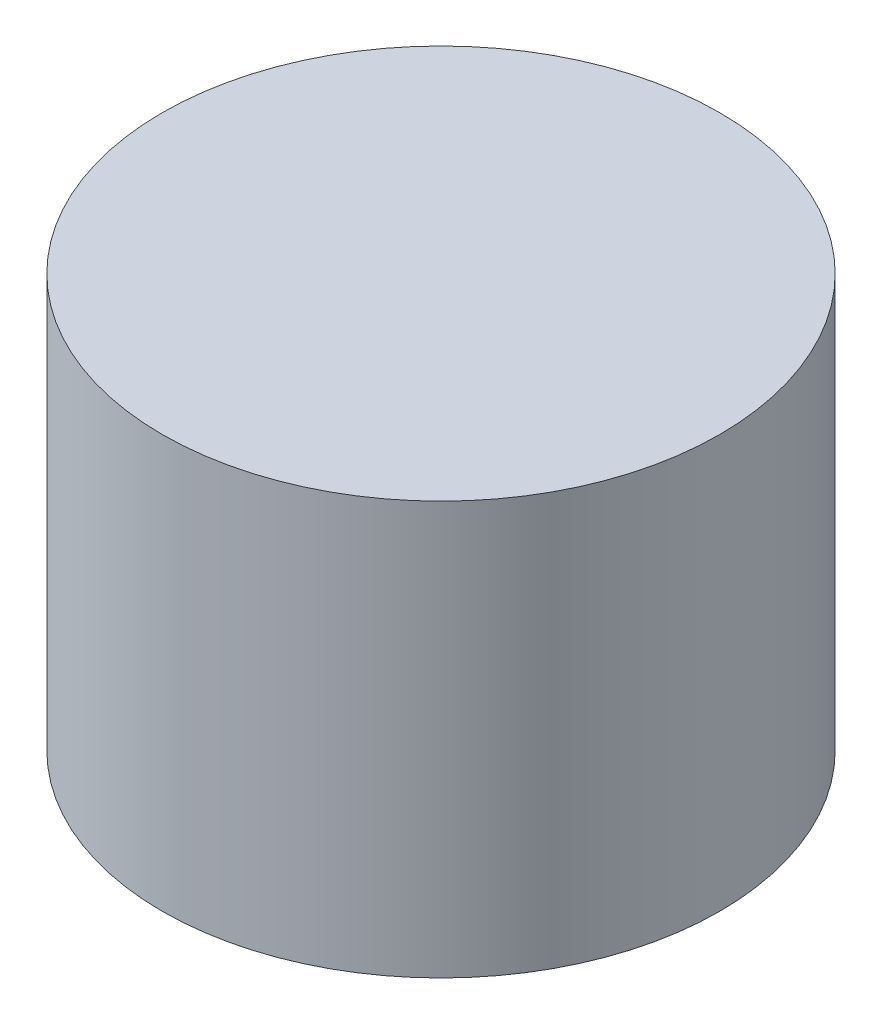
ISO-10303-21;
HEADER;
FILE_DESCRIPTION(('STEP AP214'),'2;1');
FILE_NAME('part.step','',(''),(''),'','','');
FILE_SCHEMA(('AUTOMOTIVE_DESIGN { 1 0 10303 214 1 1 1 1 }'));
ENDSEC;
DATA;
#1=APPLICATION_CONTEXT('core data for automotive mechanical design processes');
#2=APPLICATION_PROTOCOL_DEFINITION('international standard','automotive_design',2000,#1);
#3=PRODUCT_CONTEXT('',#1,'mechanical');
#4=PRODUCT('Part','Part','',(#3));
#5=PRODUCT_RELATED_PRODUCT_CATEGORY('part','',(#4));
#6=PRODUCT_DEFINITION_FORMATION('','',#4);
#7=PRODUCT_DEFINITION_CONTEXT('part definition',#1,'design');
#8=PRODUCT_DEFINITION('design','',#6,#7);
#9=PRODUCT_DEFINITION_SHAPE('','',#8);
#10=(LENGTH_UNIT() NAMED_UNIT(*) SI_UNIT(.MILLI.,.METRE.));
#11=(NAMED_UNIT(*) PLANE_ANGLE_UNIT() SI_UNIT($,.RADIAN.));
#12=(NAMED_UNIT(*) SI_UNIT($,.STERADIAN.) SOLID_ANGLE_UNIT());
#13=UNCERTAINTY_MEASURE_WITH_UNIT(LENGTH_MEASURE(1.E-05),#10,'distance_accuracy_value','');
#14=(GEOMETRIC_REPRESENTATION_CONTEXT(3) GLOBAL_UNCERTAINTY_ASSIGNED_CONTEXT((#13)) GLOBAL_UNIT_ASSIGNED_CONTEXT((#10,
#11,#12)) REPRESENTATION_CONTEXT('',''));
#15=CARTESIAN_POINT('',(0.,0.,0.));
#16=DIRECTION('',(0.,0.,1.));
#17=DIRECTION('',(1.,0.,0.));
#18=AXIS2_PLACEMENT_3D('',#15,#16,#17);
#19=CARTESIAN_POINT('',(0.,20.,0.));
#20=DIRECTION('',(0.,-1.,0.));
#21=DIRECTION('',(0.,0.,-1.));
#22=AXIS2_PLACEMENT_3D('',#19,#20,#21);
#23=CYLINDRICAL_SURFACE('',#22,13.5);
#24=CARTESIAN_POINT('',(0.,20.,0.));
#25=DIRECTION('',(0.,1.,0.));
#26=DIRECTION('',(0.,0.,1.));
#27=AXIS2_PLACEMENT_3D('',#24,#25,#26);
#28=CIRCLE('',#27,13.5);
#29=CARTESIAN_POINT('',(0.,20.,13.5));
#30=VERTEX_POINT('',#29);
#31=EDGE_CURVE('E10',#30,#30,#28,.T.);
#32=ORIENTED_EDGE('',*,*,#31,.F.);
#33=EDGE_LOOP('',(#32));
#34=FACE_BOUND('',#33,.T.);
#35=CARTESIAN_POINT('',(0.,0.,0.));
#36=DIRECTION('',(0.,1.,0.));
#37=DIRECTION('',(0.,0.,1.));
#38=AXIS2_PLACEMENT_3D('',#35,#36,#37);
#39=CIRCLE('',#38,13.5);
#40=CARTESIAN_POINT('',(0.,0.,13.5));
#41=VERTEX_POINT('',#40);
#42=EDGE_CURVE('E35',#41,#41,#39,.T.);
#43=ORIENTED_EDGE('',*,*,#42,.T.);
#44=EDGE_LOOP('',(#43));
#45=FACE_BOUND('',#44,.T.);
#46=ADVANCED_FACE('F32',(#34,#45),#23,.T.);
#47=CARTESIAN_POINT('',(0.,20.,0.));
#48=DIRECTION('',(0.,1.,0.));
#49=DIRECTION('',(0.,0.,1.));
#50=AXIS2_PLACEMENT_3D('',#47,#48,#49);
#51=PLANE('',#50);
#52=ORIENTED_EDGE('',*,*,#31,.T.);
#53=EDGE_LOOP('',(#52));
#54=FACE_BOUND('',#53,.T.);
#55=ADVANCED_FACE('F47',(#54),#51,.T.);
#56=CARTESIAN_POINT('',(0.,0.,0.));
#57=DIRECTION('',(0.,1.,0.));
#58=DIRECTION('',(0.,0.,1.));
#59=AXIS2_PLACEMENT_3D('',#56,#57,#58);
#60=PLANE('',#59);
#61=ORIENTED_EDGE('',*,*,#42,.F.);
#62=EDGE_LOOP('',(#61));
#63=FACE_BOUND('',#62,.T.);
#64=ADVANCED_FACE('F45',(#63),#60,.F.);
#65=CLOSED_SHELL('',(#46,#55,#64));
#66=MANIFOLD_SOLID_BREP('B2',#65);
#67=ADVANCED_BREP_SHAPE_REPRESENTATION('',(#18,#66),#14);
#68=SHAPE_DEFINITION_REPRESENTATION(#9,#67);
ENDSEC;
END-ISO-10303-21;
